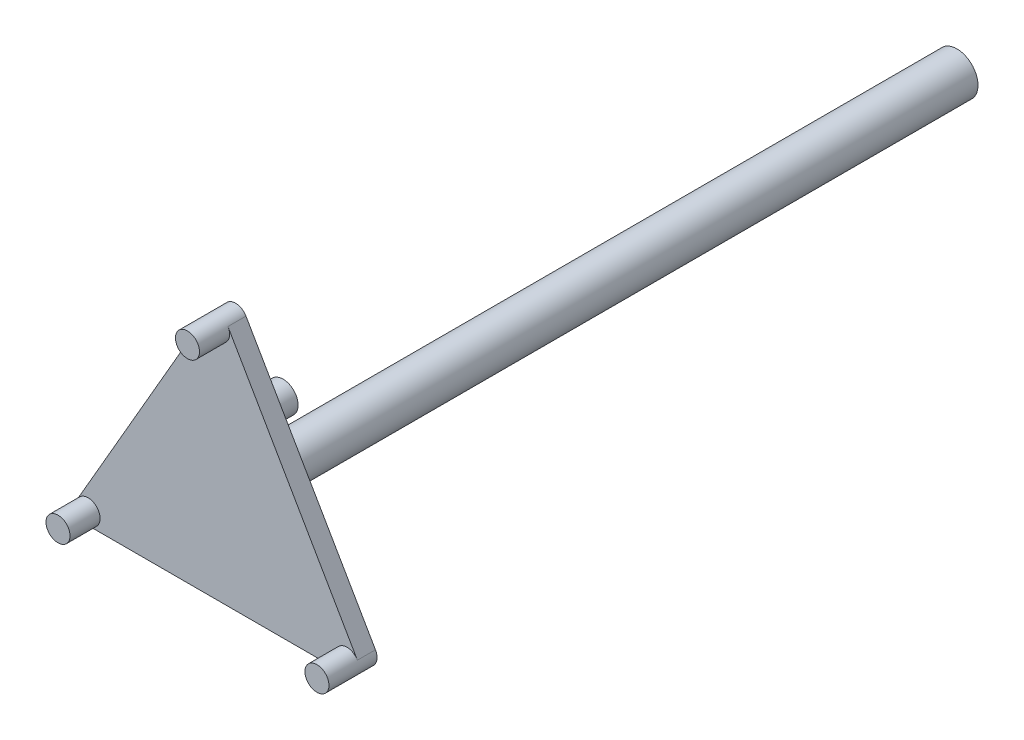
ISO-10303-21;
HEADER;
FILE_DESCRIPTION(('STEP AP214'),'2;1');
FILE_NAME('part.step','',(''),(''),'','','');
FILE_SCHEMA(('AUTOMOTIVE_DESIGN { 1 0 10303 214 1 1 1 1 }'));
ENDSEC;
DATA;
#1=APPLICATION_CONTEXT('core data for automotive mechanical design processes');
#2=APPLICATION_PROTOCOL_DEFINITION('international standard','automotive_design',2000,#1);
#3=PRODUCT_CONTEXT('',#1,'mechanical');
#4=PRODUCT('Part','Part','',(#3));
#5=PRODUCT_RELATED_PRODUCT_CATEGORY('part','',(#4));
#6=PRODUCT_DEFINITION_FORMATION('','',#4);
#7=PRODUCT_DEFINITION_CONTEXT('part definition',#1,'design');
#8=PRODUCT_DEFINITION('design','',#6,#7);
#9=PRODUCT_DEFINITION_SHAPE('','',#8);
#10=(LENGTH_UNIT() NAMED_UNIT(*) SI_UNIT(.MILLI.,.METRE.));
#11=(NAMED_UNIT(*) PLANE_ANGLE_UNIT() SI_UNIT($,.RADIAN.));
#12=(NAMED_UNIT(*) SI_UNIT($,.STERADIAN.) SOLID_ANGLE_UNIT());
#13=UNCERTAINTY_MEASURE_WITH_UNIT(LENGTH_MEASURE(1.E-05),#10,'distance_accuracy_value','');
#14=(GEOMETRIC_REPRESENTATION_CONTEXT(3) GLOBAL_UNCERTAINTY_ASSIGNED_CONTEXT((#13)) GLOBAL_UNIT_ASSIGNED_CONTEXT((#10,
#11,#12)) REPRESENTATION_CONTEXT('',''));
#15=CARTESIAN_POINT('',(0.,0.,0.));
#16=DIRECTION('',(0.,0.,1.));
#17=DIRECTION('',(1.,0.,0.));
#18=AXIS2_PLACEMENT_3D('',#15,#16,#17);
#19=CARTESIAN_POINT('',(-21.5358983848623,-12.4337567297407,3.));
#20=DIRECTION('',(0.,0.,1.));
#21=DIRECTION('',(1.,0.,0.));
#22=AXIS2_PLACEMENT_3D('',#19,#20,#21);
#23=PLANE('',#22);
#24=DIRECTION('',(-0.5,-0.866025403784439,0.));
#25=VECTOR('',#24,1.);
#26=CARTESIAN_POINT('',(-1.7320508075689,25.8675134594813,3.));
#27=LINE('',#26,#25);
#28=CARTESIAN_POINT('',(-1.7320508075689,25.8675134594813,3.));
#29=VERTEX_POINT('',#28);
#30=CARTESIAN_POINT('',(-23.2679491924311,-11.4337567297407,3.));
#31=VERTEX_POINT('',#30);
#32=EDGE_CURVE('E59',#29,#31,#27,.T.);
#33=ORIENTED_EDGE('',*,*,#32,.T.);
#34=CARTESIAN_POINT('',(-21.5358983848623,-12.4337567297407,3.));
#35=DIRECTION('',(0.,0.,1.));
#36=DIRECTION('',(1.,0.,0.));
#37=AXIS2_PLACEMENT_3D('',#34,#35,#36);
#38=CIRCLE('',#37,2.);
#39=CARTESIAN_POINT('',(-21.5358983848623,-14.4337567297407,3.));
#40=VERTEX_POINT('',#39);
#41=EDGE_CURVE('E109',#40,#31,#38,.T.);
#42=ORIENTED_EDGE('',*,*,#41,.F.);
#43=DIRECTION('',(1.,0.,0.));
#44=VECTOR('',#43,1.);
#45=CARTESIAN_POINT('',(-21.5358983848623,-14.4337567297407,3.));
#46=LINE('',#45,#44);
#47=CARTESIAN_POINT('',(21.5358983848622,-14.4337567297406,3.));
#48=VERTEX_POINT('',#47);
#49=EDGE_CURVE('E93',#40,#48,#46,.T.);
#50=ORIENTED_EDGE('',*,*,#49,.T.);
#51=CARTESIAN_POINT('',(21.5358983848622,-12.4337567297406,3.));
#52=DIRECTION('',(0.,0.,1.));
#53=DIRECTION('',(1.,0.,0.));
#54=AXIS2_PLACEMENT_3D('',#51,#52,#53);
#55=CIRCLE('',#54,2.);
#56=CARTESIAN_POINT('',(23.2679491924311,-11.4337567297406,3.));
#57=VERTEX_POINT('',#56);
#58=EDGE_CURVE('E130',#57,#48,#55,.T.);
#59=ORIENTED_EDGE('',*,*,#58,.F.);
#60=DIRECTION('',(-0.5,0.866025403784439,0.));
#61=VECTOR('',#60,1.);
#62=CARTESIAN_POINT('',(23.2679491924311,-11.4337567297406,3.));
#63=LINE('',#62,#61);
#64=CARTESIAN_POINT('',(1.73205080756887,25.8675134594813,3.));
#65=VERTEX_POINT('',#64);
#66=EDGE_CURVE('E121',#57,#65,#63,.T.);
#67=ORIENTED_EDGE('',*,*,#66,.T.);
#68=CARTESIAN_POINT('',(0.,24.8675134594813,3.));
#69=DIRECTION('',(0.,0.,1.));
#70=DIRECTION('',(1.,0.,0.));
#71=AXIS2_PLACEMENT_3D('',#68,#69,#70);
#72=CIRCLE('',#71,2.);
#73=EDGE_CURVE('E146',#29,#65,#72,.T.);
#74=ORIENTED_EDGE('',*,*,#73,.F.);
#75=EDGE_LOOP('',(#33,#42,#50,#59,#67,#74));
#76=FACE_BOUND('',#75,.T.);
#77=ADVANCED_FACE('F41',(#76),#23,.T.);
#78=CARTESIAN_POINT('',(-21.5358983848623,-12.4337567297407,3.));
#79=DIRECTION('',(0.,0.,-1.));
#80=DIRECTION('',(-1.,0.,0.));
#81=AXIS2_PLACEMENT_3D('',#78,#79,#80);
#82=CYLINDRICAL_SURFACE('',#81,2.);
#83=CARTESIAN_POINT('',(-21.5358983848623,-12.4337567297407,0.));
#84=DIRECTION('',(0.,0.,1.));
#85=DIRECTION('',(1.,0.,0.));
#86=AXIS2_PLACEMENT_3D('',#83,#84,#85);
#87=CIRCLE('',#86,2.);
#88=CARTESIAN_POINT('',(-23.2679491924311,-11.4337567297407,0.));
#89=VERTEX_POINT('',#88);
#90=CARTESIAN_POINT('',(-21.5358983848623,-14.4337567297407,0.));
#91=VERTEX_POINT('',#90);
#92=EDGE_CURVE('E111',#89,#91,#87,.T.);
#93=ORIENTED_EDGE('',*,*,#92,.T.);
#94=DIRECTION('',(0.,0.,-1.));
#95=VECTOR('',#94,1.);
#96=CARTESIAN_POINT('',(-21.5358983848623,-14.4337567297407,3.));
#97=LINE('',#96,#95);
#98=EDGE_CURVE('E107',#40,#91,#97,.T.);
#99=ORIENTED_EDGE('',*,*,#98,.F.);
#100=ORIENTED_EDGE('',*,*,#41,.T.);
#101=DIRECTION('',(0.,0.,-1.));
#102=VECTOR('',#101,1.);
#103=CARTESIAN_POINT('',(-23.2679491924311,-11.4337567297407,3.));
#104=LINE('',#103,#102);
#105=EDGE_CURVE('E156',#31,#89,#104,.T.);
#106=ORIENTED_EDGE('',*,*,#105,.T.);
#107=EDGE_LOOP('',(#93,#99,#100,#106));
#108=FACE_BOUND('',#107,.T.);
#109=CARTESIAN_POINT('',(-21.5358983848623,-12.4337567297407,8.));
#110=DIRECTION('',(0.,0.,1.));
#111=DIRECTION('',(1.,0.,0.));
#112=AXIS2_PLACEMENT_3D('',#109,#110,#111);
#113=CIRCLE('',#112,2.);
#114=CARTESIAN_POINT('',(-19.5358983848623,-12.4337567297407,8.));
#115=VERTEX_POINT('',#114);
#116=EDGE_CURVE('E124',#115,#115,#113,.T.);
#117=ORIENTED_EDGE('',*,*,#116,.F.);
#118=EDGE_LOOP('',(#117));
#119=FACE_BOUND('',#118,.T.);
#120=ADVANCED_FACE('F43',(#108,#119),#82,.T.);
#121=CARTESIAN_POINT('',(-21.5358983848623,-14.4337567297407,3.));
#122=DIRECTION('',(0.,1.,0.));
#123=DIRECTION('',(-1.,0.,0.));
#124=AXIS2_PLACEMENT_3D('',#121,#122,#123);
#125=PLANE('',#124);
#126=DIRECTION('',(1.,0.,0.));
#127=VECTOR('',#126,1.);
#128=CARTESIAN_POINT('',(-21.5358983848623,-14.4337567297407,0.));
#129=LINE('',#128,#127);
#130=CARTESIAN_POINT('',(21.5358983848622,-14.4337567297406,0.));
#131=VERTEX_POINT('',#130);
#132=EDGE_CURVE('E159',#91,#131,#129,.T.);
#133=ORIENTED_EDGE('',*,*,#132,.T.);
#134=DIRECTION('',(0.,0.,-1.));
#135=VECTOR('',#134,1.);
#136=CARTESIAN_POINT('',(21.5358983848622,-14.4337567297406,3.));
#137=LINE('',#136,#135);
#138=EDGE_CURVE('E115',#48,#131,#137,.T.);
#139=ORIENTED_EDGE('',*,*,#138,.F.);
#140=ORIENTED_EDGE('',*,*,#49,.F.);
#141=ORIENTED_EDGE('',*,*,#98,.T.);
#142=EDGE_LOOP('',(#133,#139,#140,#141));
#143=FACE_BOUND('',#142,.T.);
#144=ADVANCED_FACE('F117',(#143),#125,.F.);
#145=CARTESIAN_POINT('',(21.5358983848622,-12.4337567297406,3.));
#146=DIRECTION('',(0.,0.,-1.));
#147=DIRECTION('',(-1.,0.,0.));
#148=AXIS2_PLACEMENT_3D('',#145,#146,#147);
#149=CYLINDRICAL_SURFACE('',#148,2.);
#150=CARTESIAN_POINT('',(21.5358983848622,-12.4337567297406,0.));
#151=DIRECTION('',(0.,0.,1.));
#152=DIRECTION('',(-1.,0.,0.));
#153=AXIS2_PLACEMENT_3D('',#150,#151,#152);
#154=CIRCLE('',#153,2.);
#155=CARTESIAN_POINT('',(23.2679491924311,-11.4337567297406,0.));
#156=VERTEX_POINT('',#155);
#157=EDGE_CURVE('E162',#131,#156,#154,.T.);
#158=ORIENTED_EDGE('',*,*,#157,.T.);
#159=DIRECTION('',(0.,0.,-1.));
#160=VECTOR('',#159,1.);
#161=CARTESIAN_POINT('',(23.2679491924311,-11.4337567297406,3.));
#162=LINE('',#161,#160);
#163=EDGE_CURVE('E180',#57,#156,#162,.T.);
#164=ORIENTED_EDGE('',*,*,#163,.F.);
#165=ORIENTED_EDGE('',*,*,#58,.T.);
#166=ORIENTED_EDGE('',*,*,#138,.T.);
#167=EDGE_LOOP('',(#158,#164,#165,#166));
#168=FACE_BOUND('',#167,.T.);
#169=CARTESIAN_POINT('',(21.5358983848622,-12.4337567297406,8.));
#170=DIRECTION('',(0.,0.,1.));
#171=DIRECTION('',(1.,0.,0.));
#172=AXIS2_PLACEMENT_3D('',#169,#170,#171);
#173=CIRCLE('',#172,2.);
#174=CARTESIAN_POINT('',(23.5358983848622,-12.4337567297406,8.));
#175=VERTEX_POINT('',#174);
#176=EDGE_CURVE('E136',#175,#175,#173,.T.);
#177=ORIENTED_EDGE('',*,*,#176,.F.);
#178=EDGE_LOOP('',(#177));
#179=FACE_BOUND('',#178,.T.);
#180=ADVANCED_FACE('F211',(#168,#179),#149,.T.);
#181=CARTESIAN_POINT('',(23.2679491924311,-11.4337567297406,3.));
#182=DIRECTION('',(-0.866025403784439,-0.5,0.));
#183=DIRECTION('',(0.5,-0.866025403784439,0.));
#184=AXIS2_PLACEMENT_3D('',#181,#182,#183);
#185=PLANE('',#184);
#186=DIRECTION('',(-0.5,0.866025403784439,0.));
#187=VECTOR('',#186,1.);
#188=CARTESIAN_POINT('',(23.2679491924311,-11.4337567297406,0.));
#189=LINE('',#188,#187);
#190=CARTESIAN_POINT('',(1.73205080756889,25.8675134594813,0.));
#191=VERTEX_POINT('',#190);
#192=EDGE_CURVE('E165',#156,#191,#189,.T.);
#193=ORIENTED_EDGE('',*,*,#192,.T.);
#194=DIRECTION('',(0.,0.,-1.));
#195=VECTOR('',#194,1.);
#196=CARTESIAN_POINT('',(1.73205080756889,25.8675134594813,3.));
#197=LINE('',#196,#195);
#198=EDGE_CURVE('E177',#65,#191,#197,.T.);
#199=ORIENTED_EDGE('',*,*,#198,.F.);
#200=ORIENTED_EDGE('',*,*,#66,.F.);
#201=ORIENTED_EDGE('',*,*,#163,.T.);
#202=EDGE_LOOP('',(#193,#199,#200,#201));
#203=FACE_BOUND('',#202,.T.);
#204=ADVANCED_FACE('F222',(#203),#185,.F.);
#205=CARTESIAN_POINT('',(0.,24.8675134594813,3.));
#206=DIRECTION('',(0.,0.,-1.));
#207=DIRECTION('',(-1.,0.,0.));
#208=AXIS2_PLACEMENT_3D('',#205,#206,#207);
#209=CYLINDRICAL_SURFACE('',#208,2.);
#210=CARTESIAN_POINT('',(0.,24.8675134594813,0.));
#211=DIRECTION('',(0.,0.,1.));
#212=DIRECTION('',(1.,0.,0.));
#213=AXIS2_PLACEMENT_3D('',#210,#211,#212);
#214=CIRCLE('',#213,2.);
#215=CARTESIAN_POINT('',(-1.7320508075689,25.8675134594813,0.));
#216=VERTEX_POINT('',#215);
#217=EDGE_CURVE('E83',#191,#216,#214,.T.);
#218=ORIENTED_EDGE('',*,*,#217,.T.);
#219=DIRECTION('',(0.,0.,-1.));
#220=VECTOR('',#219,1.);
#221=CARTESIAN_POINT('',(-1.7320508075689,25.8675134594813,3.));
#222=LINE('',#221,#220);
#223=EDGE_CURVE('E174',#29,#216,#222,.T.);
#224=ORIENTED_EDGE('',*,*,#223,.F.);
#225=ORIENTED_EDGE('',*,*,#73,.T.);
#226=ORIENTED_EDGE('',*,*,#198,.T.);
#227=EDGE_LOOP('',(#218,#224,#225,#226));
#228=FACE_BOUND('',#227,.T.);
#229=CARTESIAN_POINT('',(0.,24.8675134594813,8.));
#230=DIRECTION('',(0.,0.,1.));
#231=DIRECTION('',(1.,0.,0.));
#232=AXIS2_PLACEMENT_3D('',#229,#230,#231);
#233=CIRCLE('',#232,2.);
#234=CARTESIAN_POINT('',(1.99999999999999,24.8675134594813,8.));
#235=VERTEX_POINT('',#234);
#236=EDGE_CURVE('E140',#235,#235,#233,.T.);
#237=ORIENTED_EDGE('',*,*,#236,.F.);
#238=EDGE_LOOP('',(#237));
#239=FACE_BOUND('',#238,.T.);
#240=ADVANCED_FACE('F215',(#228,#239),#209,.T.);
#241=CARTESIAN_POINT('',(-1.7320508075689,25.8675134594813,3.));
#242=DIRECTION('',(0.866025403784439,-0.5,0.));
#243=DIRECTION('',(0.5,0.866025403784439,0.));
#244=AXIS2_PLACEMENT_3D('',#241,#242,#243);
#245=PLANE('',#244);
#246=DIRECTION('',(-0.5,-0.866025403784439,0.));
#247=VECTOR('',#246,1.);
#248=CARTESIAN_POINT('',(-1.7320508075689,25.8675134594813,0.));
#249=LINE('',#248,#247);
#250=EDGE_CURVE('E88',#216,#89,#249,.T.);
#251=ORIENTED_EDGE('',*,*,#250,.T.);
#252=ORIENTED_EDGE('',*,*,#105,.F.);
#253=ORIENTED_EDGE('',*,*,#32,.F.);
#254=ORIENTED_EDGE('',*,*,#223,.T.);
#255=EDGE_LOOP('',(#251,#252,#253,#254));
#256=FACE_BOUND('',#255,.T.);
#257=ADVANCED_FACE('F201',(#256),#245,.F.);
#258=CARTESIAN_POINT('',(-21.5358983848623,-12.4337567297407,0.));
#259=DIRECTION('',(0.,0.,1.));
#260=DIRECTION('',(1.,0.,0.));
#261=AXIS2_PLACEMENT_3D('',#258,#259,#260);
#262=PLANE('',#261);
#263=CARTESIAN_POINT('',(4.90192378864682,14.3771324027147,0.));
#264=DIRECTION('',(0.,0.,1.));
#265=DIRECTION('',(1.,0.,0.));
#266=AXIS2_PLACEMENT_3D('',#263,#264,#265);
#267=CIRCLE('',#266,2.5);
#268=CARTESIAN_POINT('',(7.40192378864682,14.3771324027147,0.));
#269=VERTEX_POINT('',#268);
#270=EDGE_CURVE('E11',#269,#269,#267,.F.);
#271=ORIENTED_EDGE('',*,*,#270,.F.);
#272=EDGE_LOOP('',(#271));
#273=FACE_BOUND('',#272,.T.);
#274=CARTESIAN_POINT('',(-14.9019237886467,-2.94337567297399,0.));
#275=DIRECTION('',(0.,0.,1.));
#276=DIRECTION('',(1.,0.,0.));
#277=AXIS2_PLACEMENT_3D('',#274,#275,#276);
#278=CIRCLE('',#277,2.5);
#279=CARTESIAN_POINT('',(-12.4019237886467,-2.94337567297399,0.));
#280=VERTEX_POINT('',#279);
#281=EDGE_CURVE('E51',#280,#280,#278,.F.);
#282=ORIENTED_EDGE('',*,*,#281,.F.);
#283=EDGE_LOOP('',(#282));
#284=FACE_BOUND('',#283,.T.);
#285=CARTESIAN_POINT('',(10.,-11.4337567297406,0.));
#286=DIRECTION('',(0.,0.,1.));
#287=DIRECTION('',(1.,0.,0.));
#288=AXIS2_PLACEMENT_3D('',#285,#286,#287);
#289=CIRCLE('',#288,2.5);
#290=CARTESIAN_POINT('',(12.5,-11.4337567297406,0.));
#291=VERTEX_POINT('',#290);
#292=EDGE_CURVE('E149',#291,#291,#289,.F.);
#293=ORIENTED_EDGE('',*,*,#292,.F.);
#294=EDGE_LOOP('',(#293));
#295=FACE_BOUND('',#294,.T.);
#296=CARTESIAN_POINT('',(0.,0.,0.));
#297=DIRECTION('',(0.,0.,1.));
#298=DIRECTION('',(1.,0.,0.));
#299=AXIS2_PLACEMENT_3D('',#296,#297,#298);
#300=CIRCLE('',#299,3.5);
#301=CARTESIAN_POINT('',(3.5,0.,0.));
#302=VERTEX_POINT('',#301);
#303=EDGE_CURVE('E114',#302,#302,#300,.F.);
#304=ORIENTED_EDGE('',*,*,#303,.F.);
#305=EDGE_LOOP('',(#304));
#306=FACE_BOUND('',#305,.T.);
#307=ORIENTED_EDGE('',*,*,#92,.F.);
#308=ORIENTED_EDGE('',*,*,#250,.F.);
#309=ORIENTED_EDGE('',*,*,#217,.F.);
#310=ORIENTED_EDGE('',*,*,#192,.F.);
#311=ORIENTED_EDGE('',*,*,#157,.F.);
#312=ORIENTED_EDGE('',*,*,#132,.F.);
#313=EDGE_LOOP('',(#307,#308,#309,#310,#311,#312));
#314=FACE_BOUND('',#313,.T.);
#315=ADVANCED_FACE('F197',(#273,#284,#295,#306,#314),#262,.F.);
#316=CARTESIAN_POINT('',(0.,0.,-10.));
#317=DIRECTION('',(0.,0.,1.));
#318=DIRECTION('',(1.,0.,0.));
#319=AXIS2_PLACEMENT_3D('',#316,#317,#318);
#320=CYLINDRICAL_SURFACE('',#319,3.5);
#321=ORIENTED_EDGE('',*,*,#303,.T.);
#322=EDGE_LOOP('',(#321));
#323=FACE_BOUND('',#322,.T.);
#324=CARTESIAN_POINT('',(0.,0.,-120.));
#325=DIRECTION('',(0.,0.,-1.));
#326=DIRECTION('',(-1.,0.,0.));
#327=AXIS2_PLACEMENT_3D('',#324,#325,#326);
#328=CIRCLE('',#327,3.5);
#329=CARTESIAN_POINT('',(-3.5,0.,-120.));
#330=VERTEX_POINT('',#329);
#331=EDGE_CURVE('E275',#330,#330,#328,.T.);
#332=ORIENTED_EDGE('',*,*,#331,.F.);
#333=EDGE_LOOP('',(#332));
#334=FACE_BOUND('',#333,.T.);
#335=ADVANCED_FACE('F200',(#323,#334),#320,.T.);
#336=CARTESIAN_POINT('',(0.,24.8675134594813,8.));
#337=DIRECTION('',(0.,0.,1.));
#338=DIRECTION('',(1.,0.,0.));
#339=AXIS2_PLACEMENT_3D('',#336,#337,#338);
#340=PLANE('',#339);
#341=ORIENTED_EDGE('',*,*,#236,.T.);
#342=EDGE_LOOP('',(#341));
#343=FACE_BOUND('',#342,.T.);
#344=ADVANCED_FACE('F232',(#343),#340,.T.);
#345=CARTESIAN_POINT('',(21.5358983848622,-12.4337567297406,8.));
#346=DIRECTION('',(0.,0.,1.));
#347=DIRECTION('',(1.,0.,0.));
#348=AXIS2_PLACEMENT_3D('',#345,#346,#347);
#349=PLANE('',#348);
#350=ORIENTED_EDGE('',*,*,#176,.T.);
#351=EDGE_LOOP('',(#350));
#352=FACE_BOUND('',#351,.T.);
#353=ADVANCED_FACE('F236',(#352),#349,.T.);
#354=CARTESIAN_POINT('',(-21.5358983848623,-12.4337567297407,8.));
#355=DIRECTION('',(0.,0.,1.));
#356=DIRECTION('',(1.,0.,0.));
#357=AXIS2_PLACEMENT_3D('',#354,#355,#356);
#358=PLANE('',#357);
#359=ORIENTED_EDGE('',*,*,#116,.T.);
#360=EDGE_LOOP('',(#359));
#361=FACE_BOUND('',#360,.T.);
#362=ADVANCED_FACE('F240',(#361),#358,.T.);
#363=CARTESIAN_POINT('',(10.,-11.4337567297406,-3.));
#364=DIRECTION('',(0.,0.,1.));
#365=DIRECTION('',(1.,0.,0.));
#366=AXIS2_PLACEMENT_3D('',#363,#364,#365);
#367=CYLINDRICAL_SURFACE('',#366,2.5);
#368=CARTESIAN_POINT('',(10.,-11.4337567297406,-3.));
#369=DIRECTION('',(0.,0.,-1.));
#370=DIRECTION('',(-1.,0.,0.));
#371=AXIS2_PLACEMENT_3D('',#368,#369,#370);
#372=CIRCLE('',#371,2.5);
#373=CARTESIAN_POINT('',(7.5,-11.4337567297406,-3.));
#374=VERTEX_POINT('',#373);
#375=EDGE_CURVE('E125',#374,#374,#372,.T.);
#376=ORIENTED_EDGE('',*,*,#375,.F.);
#377=EDGE_LOOP('',(#376));
#378=FACE_BOUND('',#377,.T.);
#379=ORIENTED_EDGE('',*,*,#292,.T.);
#380=EDGE_LOOP('',(#379));
#381=FACE_BOUND('',#380,.T.);
#382=ADVANCED_FACE('F244',(#378,#381),#367,.T.);
#383=CARTESIAN_POINT('',(10.,-11.4337567297406,-3.));
#384=DIRECTION('',(0.,0.,-1.));
#385=DIRECTION('',(-1.,0.,0.));
#386=AXIS2_PLACEMENT_3D('',#383,#384,#385);
#387=PLANE('',#386);
#388=ORIENTED_EDGE('',*,*,#375,.T.);
#389=EDGE_LOOP('',(#388));
#390=FACE_BOUND('',#389,.T.);
#391=ADVANCED_FACE('F248',(#390),#387,.T.);
#392=CARTESIAN_POINT('',(-14.9019237886467,-2.94337567297399,-3.));
#393=DIRECTION('',(0.,0.,1.));
#394=DIRECTION('',(1.,0.,0.));
#395=AXIS2_PLACEMENT_3D('',#392,#393,#394);
#396=CYLINDRICAL_SURFACE('',#395,2.5);
#397=CARTESIAN_POINT('',(-14.9019237886467,-2.94337567297399,-3.));
#398=DIRECTION('',(0.,0.,-1.));
#399=DIRECTION('',(0.500000000000004,0.866025403784436,0.));
#400=AXIS2_PLACEMENT_3D('',#397,#398,#399);
#401=CIRCLE('',#400,2.5);
#402=CARTESIAN_POINT('',(-13.6519237886467,-0.778312163512903,-3.));
#403=VERTEX_POINT('',#402);
#404=EDGE_CURVE('E133',#403,#403,#401,.T.);
#405=ORIENTED_EDGE('',*,*,#404,.F.);
#406=EDGE_LOOP('',(#405));
#407=FACE_BOUND('',#406,.T.);
#408=ORIENTED_EDGE('',*,*,#281,.T.);
#409=EDGE_LOOP('',(#408));
#410=FACE_BOUND('',#409,.T.);
#411=ADVANCED_FACE('F195',(#407,#410),#396,.T.);
#412=CARTESIAN_POINT('',(-14.9019237886467,-2.94337567297399,-3.));
#413=DIRECTION('',(0.,0.,-1.));
#414=DIRECTION('',(0.500000000000004,0.866025403784436,0.));
#415=AXIS2_PLACEMENT_3D('',#412,#413,#414);
#416=PLANE('',#415);
#417=ORIENTED_EDGE('',*,*,#404,.T.);
#418=EDGE_LOOP('',(#417));
#419=FACE_BOUND('',#418,.T.);
#420=ADVANCED_FACE('F255',(#419),#416,.T.);
#421=CARTESIAN_POINT('',(4.90192378864682,14.3771324027147,-3.));
#422=DIRECTION('',(0.,0.,1.));
#423=DIRECTION('',(1.,0.,0.));
#424=AXIS2_PLACEMENT_3D('',#421,#422,#423);
#425=CYLINDRICAL_SURFACE('',#424,2.5);
#426=CARTESIAN_POINT('',(4.90192378864682,14.3771324027147,-3.));
#427=DIRECTION('',(0.,0.,-1.));
#428=DIRECTION('',(0.499999999999992,-0.866025403784443,0.));
#429=AXIS2_PLACEMENT_3D('',#426,#427,#428);
#430=CIRCLE('',#429,2.5);
#431=CARTESIAN_POINT('',(6.1519237886468,12.2120688932536,-3.));
#432=VERTEX_POINT('',#431);
#433=EDGE_CURVE('E278',#432,#432,#430,.T.);
#434=ORIENTED_EDGE('',*,*,#433,.F.);
#435=EDGE_LOOP('',(#434));
#436=FACE_BOUND('',#435,.T.);
#437=ORIENTED_EDGE('',*,*,#270,.T.);
#438=EDGE_LOOP('',(#437));
#439=FACE_BOUND('',#438,.T.);
#440=ADVANCED_FACE('F259',(#436,#439),#425,.T.);
#441=CARTESIAN_POINT('',(4.90192378864682,14.3771324027147,-3.));
#442=DIRECTION('',(0.,0.,-1.));
#443=DIRECTION('',(0.499999999999992,-0.866025403784443,0.));
#444=AXIS2_PLACEMENT_3D('',#441,#442,#443);
#445=PLANE('',#444);
#446=ORIENTED_EDGE('',*,*,#433,.T.);
#447=EDGE_LOOP('',(#446));
#448=FACE_BOUND('',#447,.T.);
#449=ADVANCED_FACE('F263',(#448),#445,.T.);
#450=CARTESIAN_POINT('',(0.,0.,-120.));
#451=DIRECTION('',(0.,0.,-1.));
#452=DIRECTION('',(-1.,0.,0.));
#453=AXIS2_PLACEMENT_3D('',#450,#451,#452);
#454=PLANE('',#453);
#455=ORIENTED_EDGE('',*,*,#331,.T.);
#456=EDGE_LOOP('',(#455));
#457=FACE_BOUND('',#456,.T.);
#458=ADVANCED_FACE('F267',(#457),#454,.T.);
#459=CLOSED_SHELL('',(#77,#120,#144,#180,#204,#240,#257,#315,#335,#344,#353,#362,#382,#391,#411,
#420,#440,#449,#458));
#460=MANIFOLD_SOLID_BREP('B2',#459);
#461=ADVANCED_BREP_SHAPE_REPRESENTATION('',(#18,#460),#14);
#462=SHAPE_DEFINITION_REPRESENTATION(#9,#461);
ENDSEC;
END-ISO-10303-21;
